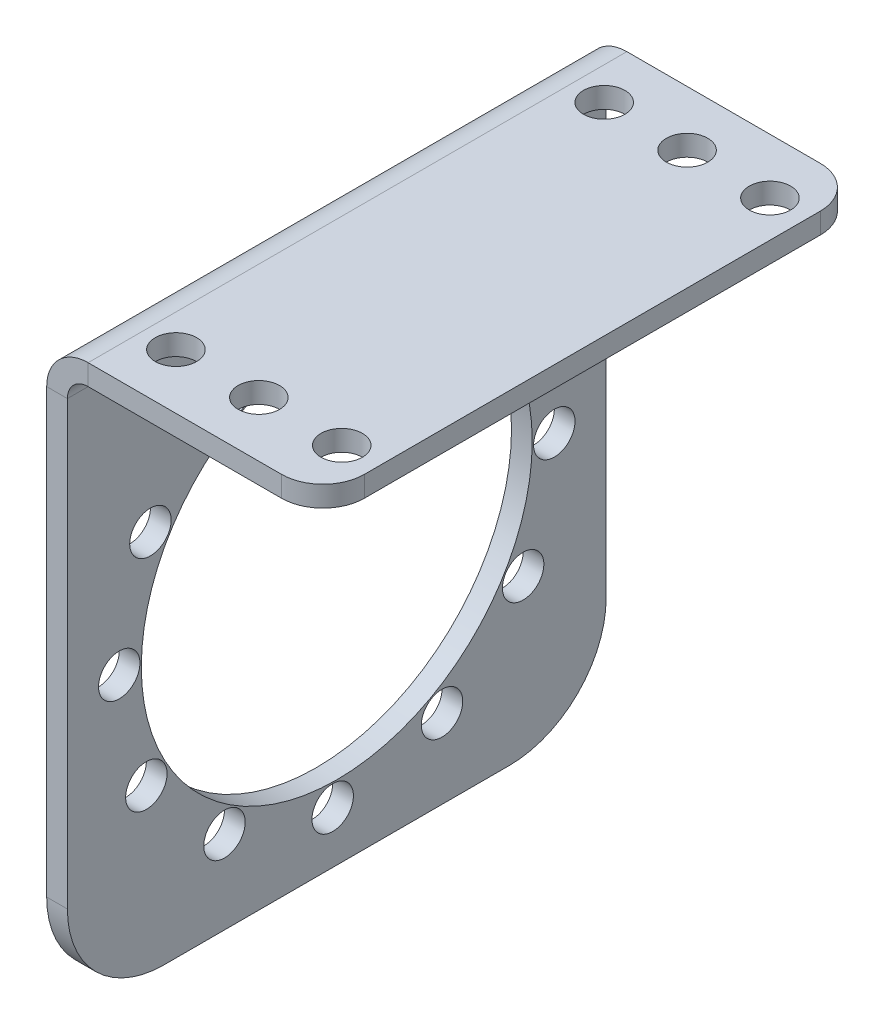
ISO-10303-21;
HEADER;
FILE_DESCRIPTION(('STEP AP214'),'2;1');
FILE_NAME('part.step','',(''),(''),'','','');
FILE_SCHEMA(('AUTOMOTIVE_DESIGN { 1 0 10303 214 1 1 1 1 }'));
ENDSEC;
DATA;
#1=APPLICATION_CONTEXT('core data for automotive mechanical design processes');
#2=APPLICATION_PROTOCOL_DEFINITION('international standard','automotive_design',2000,#1);
#3=PRODUCT_CONTEXT('',#1,'mechanical');
#4=PRODUCT('Part','Part','',(#3));
#5=PRODUCT_RELATED_PRODUCT_CATEGORY('part','',(#4));
#6=PRODUCT_DEFINITION_FORMATION('','',#4);
#7=PRODUCT_DEFINITION_CONTEXT('part definition',#1,'design');
#8=PRODUCT_DEFINITION('design','',#6,#7);
#9=PRODUCT_DEFINITION_SHAPE('','',#8);
#10=(LENGTH_UNIT() NAMED_UNIT(*) SI_UNIT(.MILLI.,.METRE.));
#11=(NAMED_UNIT(*) PLANE_ANGLE_UNIT() SI_UNIT($,.RADIAN.));
#12=(NAMED_UNIT(*) SI_UNIT($,.STERADIAN.) SOLID_ANGLE_UNIT());
#13=UNCERTAINTY_MEASURE_WITH_UNIT(LENGTH_MEASURE(1.E-05),#10,'distance_accuracy_value','');
#14=(GEOMETRIC_REPRESENTATION_CONTEXT(3) GLOBAL_UNCERTAINTY_ASSIGNED_CONTEXT((#13)) GLOBAL_UNIT_ASSIGNED_CONTEXT((#10,
#11,#12)) REPRESENTATION_CONTEXT('',''));
#15=CARTESIAN_POINT('',(0.,0.,0.));
#16=DIRECTION('',(0.,0.,1.));
#17=DIRECTION('',(1.,0.,0.));
#18=AXIS2_PLACEMENT_3D('',#15,#16,#17);
#19=CARTESIAN_POINT('',(-28.360100379747,28.4200909691457,39.));
#20=DIRECTION('',(0.,0.,1.));
#21=DIRECTION('',(1.,0.,0.));
#22=AXIS2_PLACEMENT_3D('',#19,#20,#21);
#23=PLANE('',#22);
#24=DIRECTION('',(0.,-1.,0.));
#25=VECTOR('',#24,1.);
#26=CARTESIAN_POINT('',(-28.360100379747,28.4200909691457,39.));
#27=LINE('',#26,#25);
#28=CARTESIAN_POINT('',(-28.360100379747,28.4200909691457,39.));
#29=VERTEX_POINT('',#28);
#30=CARTESIAN_POINT('',(-28.360100379747,26.9200909691457,39.));
#31=VERTEX_POINT('',#30);
#32=EDGE_CURVE('E131',#29,#31,#27,.T.);
#33=ORIENTED_EDGE('',*,*,#32,.F.);
#34=CARTESIAN_POINT('',(-28.360100379747,25.4200909691457,39.));
#35=DIRECTION('',(0.,0.,-1.));
#36=DIRECTION('',(-1.,0.,0.));
#37=AXIS2_PLACEMENT_3D('',#34,#35,#36);
#38=CIRCLE('',#37,3.);
#39=CARTESIAN_POINT('',(-31.360100379747,25.4200909691457,39.));
#40=VERTEX_POINT('',#39);
#41=EDGE_CURVE('E135',#40,#29,#38,.T.);
#42=ORIENTED_EDGE('',*,*,#41,.F.);
#43=DIRECTION('',(-1.,0.,0.));
#44=VECTOR('',#43,1.);
#45=CARTESIAN_POINT('',(-29.860100379747,25.4200909691457,39.));
#46=LINE('',#45,#44);
#47=CARTESIAN_POINT('',(-29.860100379747,25.4200909691457,39.));
#48=VERTEX_POINT('',#47);
#49=EDGE_CURVE('E140',#48,#40,#46,.T.);
#50=ORIENTED_EDGE('',*,*,#49,.F.);
#51=CARTESIAN_POINT('',(-28.360100379747,25.4200909691457,39.));
#52=DIRECTION('',(0.,0.,1.));
#53=DIRECTION('',(1.,0.,0.));
#54=AXIS2_PLACEMENT_3D('',#51,#52,#53);
#55=CIRCLE('',#54,1.5);
#56=EDGE_CURVE('E137',#48,#31,#55,.F.);
#57=ORIENTED_EDGE('',*,*,#56,.T.);
#58=EDGE_LOOP('',(#33,#42,#50,#57));
#59=FACE_BOUND('',#58,.T.);
#60=ADVANCED_FACE('F36',(#59),#23,.T.);
#61=CARTESIAN_POINT('',(-29.860100379747,25.4200909691457,39.));
#62=DIRECTION('',(0.,0.,1.));
#63=DIRECTION('',(1.,0.,0.));
#64=AXIS2_PLACEMENT_3D('',#61,#62,#63);
#65=PLANE('',#64);
#66=DIRECTION('',(1.,0.,0.));
#67=VECTOR('',#66,1.);
#68=CARTESIAN_POINT('',(-28.360100379747,26.9200909691457,39.));
#69=LINE('',#68,#67);
#70=CARTESIAN_POINT('',(-14.360100379747,26.9200909691457,39.));
#71=VERTEX_POINT('',#70);
#72=EDGE_CURVE('E155',#31,#71,#69,.T.);
#73=ORIENTED_EDGE('',*,*,#72,.T.);
#74=DIRECTION('',(0.,-1.,0.));
#75=VECTOR('',#74,1.);
#76=CARTESIAN_POINT('',(-14.360100379747,25.4200909691457,39.));
#77=LINE('',#76,#75);
#78=CARTESIAN_POINT('',(-14.360100379747,28.4200909691457,39.));
#79=VERTEX_POINT('',#78);
#80=EDGE_CURVE('E61',#71,#79,#77,.F.);
#81=ORIENTED_EDGE('',*,*,#80,.T.);
#82=DIRECTION('',(1.,0.,0.));
#83=VECTOR('',#82,1.);
#84=CARTESIAN_POINT('',(-28.360100379747,28.4200909691457,39.));
#85=LINE('',#84,#83);
#86=EDGE_CURVE('E145',#29,#79,#85,.T.);
#87=ORIENTED_EDGE('',*,*,#86,.F.);
#88=ORIENTED_EDGE('',*,*,#32,.T.);
#89=EDGE_LOOP('',(#73,#81,#87,#88));
#90=FACE_BOUND('',#89,.T.);
#91=ADVANCED_FACE('F154',(#90),#65,.T.);
#92=CARTESIAN_POINT('',(-31.360100379747,25.4200909691457,0.));
#93=DIRECTION('',(0.,0.,-1.));
#94=DIRECTION('',(-1.,0.,0.));
#95=AXIS2_PLACEMENT_3D('',#92,#93,#94);
#96=PLANE('',#95);
#97=DIRECTION('',(1.,0.,0.));
#98=VECTOR('',#97,1.);
#99=CARTESIAN_POINT('',(-31.360100379747,25.4200909691457,0.));
#100=LINE('',#99,#98);
#101=CARTESIAN_POINT('',(-31.360100379747,25.4200909691457,0.));
#102=VERTEX_POINT('',#101);
#103=CARTESIAN_POINT('',(-29.860100379747,25.4200909691457,0.));
#104=VERTEX_POINT('',#103);
#105=EDGE_CURVE('E201',#102,#104,#100,.T.);
#106=ORIENTED_EDGE('',*,*,#105,.F.);
#107=CARTESIAN_POINT('',(-28.360100379747,25.4200909691457,0.));
#108=DIRECTION('',(0.,0.,-1.));
#109=DIRECTION('',(-1.,0.,0.));
#110=AXIS2_PLACEMENT_3D('',#107,#108,#109);
#111=CIRCLE('',#110,3.);
#112=CARTESIAN_POINT('',(-28.360100379747,28.4200909691457,0.));
#113=VERTEX_POINT('',#112);
#114=EDGE_CURVE('E174',#102,#113,#111,.T.);
#115=ORIENTED_EDGE('',*,*,#114,.T.);
#116=DIRECTION('',(0.,1.,0.));
#117=VECTOR('',#116,1.);
#118=CARTESIAN_POINT('',(-28.360100379747,26.9200909691457,0.));
#119=LINE('',#118,#117);
#120=CARTESIAN_POINT('',(-28.360100379747,26.9200909691457,0.));
#121=VERTEX_POINT('',#120);
#122=EDGE_CURVE('E199',#121,#113,#119,.T.);
#123=ORIENTED_EDGE('',*,*,#122,.F.);
#124=CARTESIAN_POINT('',(-28.360100379747,25.4200909691457,0.));
#125=DIRECTION('',(0.,0.,1.));
#126=DIRECTION('',(1.,0.,0.));
#127=AXIS2_PLACEMENT_3D('',#124,#125,#126);
#128=CIRCLE('',#127,1.5);
#129=EDGE_CURVE('E180',#104,#121,#128,.F.);
#130=ORIENTED_EDGE('',*,*,#129,.F.);
#131=EDGE_LOOP('',(#106,#115,#123,#130));
#132=FACE_BOUND('',#131,.T.);
#133=ADVANCED_FACE('F334',(#132),#96,.T.);
#134=CARTESIAN_POINT('',(-28.360100379747,26.9200909691457,0.));
#135=DIRECTION('',(0.,0.,-1.));
#136=DIRECTION('',(-1.,0.,0.));
#137=AXIS2_PLACEMENT_3D('',#134,#135,#136);
#138=PLANE('',#137);
#139=DIRECTION('',(0.,1.,0.));
#140=VECTOR('',#139,1.);
#141=CARTESIAN_POINT('',(-29.860100379747,-13.5799090308543,0.));
#142=LINE('',#141,#140);
#143=CARTESIAN_POINT('',(-29.860100379747,-6.57990903085427,0.));
#144=VERTEX_POINT('',#143);
#145=EDGE_CURVE('E178',#144,#104,#142,.T.);
#146=ORIENTED_EDGE('',*,*,#145,.F.);
#147=DIRECTION('',(-1.,0.,0.));
#148=VECTOR('',#147,1.);
#149=CARTESIAN_POINT('',(-28.360100379747,-6.57990903085427,0.));
#150=LINE('',#149,#148);
#151=CARTESIAN_POINT('',(-31.360100379747,-6.57990903085427,0.));
#152=VERTEX_POINT('',#151);
#153=EDGE_CURVE('E220',#144,#152,#150,.T.);
#154=ORIENTED_EDGE('',*,*,#153,.T.);
#155=DIRECTION('',(0.,1.,0.));
#156=VECTOR('',#155,1.);
#157=CARTESIAN_POINT('',(-31.360100379747,-13.5799090308543,0.));
#158=LINE('',#157,#156);
#159=EDGE_CURVE('E176',#152,#102,#158,.T.);
#160=ORIENTED_EDGE('',*,*,#159,.T.);
#161=ORIENTED_EDGE('',*,*,#105,.T.);
#162=EDGE_LOOP('',(#146,#154,#160,#161));
#163=FACE_BOUND('',#162,.T.);
#164=ADVANCED_FACE('F351',(#163),#138,.T.);
#165=CARTESIAN_POINT('',(-28.360100379747,26.9200909691457,39.));
#166=DIRECTION('',(0.,1.,0.));
#167=DIRECTION('',(0.,0.,1.));
#168=AXIS2_PLACEMENT_3D('',#165,#166,#167);
#169=PLANE('',#168);
#170=CARTESIAN_POINT('',(-26.0021408674852,26.9200909691457,35.));
#171=DIRECTION('',(0.,1.,0.));
#172=DIRECTION('',(0.,0.,1.));
#173=AXIS2_PLACEMENT_3D('',#170,#171,#172);
#174=CIRCLE('',#173,1.5);
#175=CARTESIAN_POINT('',(-26.0021408674852,26.9200909691457,36.5));
#176=VERTEX_POINT('',#175);
#177=EDGE_CURVE('E484',#176,#176,#174,.T.);
#178=ORIENTED_EDGE('',*,*,#177,.T.);
#179=EDGE_LOOP('',(#178));
#180=FACE_BOUND('',#179,.T.);
#181=CARTESIAN_POINT('',(-14.0021408674852,26.9200909691457,35.));
#182=DIRECTION('',(0.,1.,0.));
#183=DIRECTION('',(0.,0.,1.));
#184=AXIS2_PLACEMENT_3D('',#181,#182,#183);
#185=CIRCLE('',#184,1.5);
#186=CARTESIAN_POINT('',(-14.0021408674852,26.9200909691457,36.5));
#187=VERTEX_POINT('',#186);
#188=EDGE_CURVE('E488',#187,#187,#185,.T.);
#189=ORIENTED_EDGE('',*,*,#188,.T.);
#190=EDGE_LOOP('',(#189));
#191=FACE_BOUND('',#190,.T.);
#192=CARTESIAN_POINT('',(-20.0021408674852,26.9200909691457,35.));
#193=DIRECTION('',(0.,1.,0.));
#194=DIRECTION('',(0.,0.,1.));
#195=AXIS2_PLACEMENT_3D('',#192,#193,#194);
#196=CIRCLE('',#195,1.5);
#197=CARTESIAN_POINT('',(-20.0021408674852,26.9200909691457,36.5));
#198=VERTEX_POINT('',#197);
#199=EDGE_CURVE('E497',#198,#198,#196,.T.);
#200=ORIENTED_EDGE('',*,*,#199,.T.);
#201=EDGE_LOOP('',(#200));
#202=FACE_BOUND('',#201,.T.);
#203=CARTESIAN_POINT('',(-14.0021408674855,26.9200909691457,4.));
#204=DIRECTION('',(0.,1.,0.));
#205=DIRECTION('',(0.,0.,1.));
#206=AXIS2_PLACEMENT_3D('',#203,#204,#205);
#207=CIRCLE('',#206,1.5);
#208=CARTESIAN_POINT('',(-14.0021408674855,26.9200909691457,5.5));
#209=VERTEX_POINT('',#208);
#210=EDGE_CURVE('E503',#209,#209,#207,.T.);
#211=ORIENTED_EDGE('',*,*,#210,.T.);
#212=EDGE_LOOP('',(#211));
#213=FACE_BOUND('',#212,.T.);
#214=CARTESIAN_POINT('',(-20.0021408674855,26.9200909691457,4.));
#215=DIRECTION('',(0.,1.,0.));
#216=DIRECTION('',(0.,0.,1.));
#217=AXIS2_PLACEMENT_3D('',#214,#215,#216);
#218=CIRCLE('',#217,1.5);
#219=CARTESIAN_POINT('',(-20.0021408674855,26.9200909691457,5.5));
#220=VERTEX_POINT('',#219);
#221=EDGE_CURVE('E509',#220,#220,#218,.T.);
#222=ORIENTED_EDGE('',*,*,#221,.T.);
#223=EDGE_LOOP('',(#222));
#224=FACE_BOUND('',#223,.T.);
#225=CARTESIAN_POINT('',(-26.0021408674855,26.9200909691457,4.));
#226=DIRECTION('',(0.,1.,0.));
#227=DIRECTION('',(0.,0.,1.));
#228=AXIS2_PLACEMENT_3D('',#225,#226,#227);
#229=CIRCLE('',#228,1.5);
#230=CARTESIAN_POINT('',(-26.0021408674855,26.9200909691457,5.5));
#231=VERTEX_POINT('',#230);
#232=EDGE_CURVE('E514',#231,#231,#229,.T.);
#233=ORIENTED_EDGE('',*,*,#232,.T.);
#234=EDGE_LOOP('',(#233));
#235=FACE_BOUND('',#234,.T.);
#236=DIRECTION('',(0.,0.,-1.));
#237=VECTOR('',#236,1.);
#238=CARTESIAN_POINT('',(-11.360100379747,26.9200909691457,39.));
#239=LINE('',#238,#237);
#240=CARTESIAN_POINT('',(-11.360100379747,26.9200909691457,36.));
#241=VERTEX_POINT('',#240);
#242=CARTESIAN_POINT('',(-11.360100379747,26.9200909691457,3.));
#243=VERTEX_POINT('',#242);
#244=EDGE_CURVE('E196',#241,#243,#239,.T.);
#245=ORIENTED_EDGE('',*,*,#244,.F.);
#246=CARTESIAN_POINT('',(-14.360100379747,26.9200909691457,36.));
#247=DIRECTION('',(0.,1.,0.));
#248=DIRECTION('',(0.,0.,1.));
#249=AXIS2_PLACEMENT_3D('',#246,#247,#248);
#250=CIRCLE('',#249,3.);
#251=EDGE_CURVE('E230',#241,#71,#250,.F.);
#252=ORIENTED_EDGE('',*,*,#251,.T.);
#253=ORIENTED_EDGE('',*,*,#72,.F.);
#254=DIRECTION('',(0.,0.,-1.));
#255=VECTOR('',#254,1.);
#256=CARTESIAN_POINT('',(-28.360100379747,26.9200909691457,39.));
#257=LINE('',#256,#255);
#258=EDGE_CURVE('E168',#31,#121,#257,.T.);
#259=ORIENTED_EDGE('',*,*,#258,.T.);
#260=DIRECTION('',(1.,0.,0.));
#261=VECTOR('',#260,1.);
#262=CARTESIAN_POINT('',(-28.360100379747,26.9200909691457,0.));
#263=LINE('',#262,#261);
#264=CARTESIAN_POINT('',(-14.360100379747,26.9200909691457,0.));
#265=VERTEX_POINT('',#264);
#266=EDGE_CURVE('E169',#121,#265,#263,.T.);
#267=ORIENTED_EDGE('',*,*,#266,.T.);
#268=CARTESIAN_POINT('',(-14.360100379747,26.9200909691457,3.));
#269=DIRECTION('',(0.,1.,0.));
#270=DIRECTION('',(0.,0.,1.));
#271=AXIS2_PLACEMENT_3D('',#268,#269,#270);
#272=CIRCLE('',#271,3.);
#273=EDGE_CURVE('E228',#265,#243,#272,.F.);
#274=ORIENTED_EDGE('',*,*,#273,.T.);
#275=EDGE_LOOP('',(#245,#252,#253,#259,#267,#274));
#276=FACE_BOUND('',#275,.T.);
#277=ADVANCED_FACE('F327',(#180,#191,#202,#213,#224,#235,#276),#169,.F.);
#278=CARTESIAN_POINT('',(-11.360100379747,28.4200909691457,39.));
#279=DIRECTION('',(1.,0.,0.));
#280=DIRECTION('',(0.,0.,-1.));
#281=AXIS2_PLACEMENT_3D('',#278,#279,#280);
#282=PLANE('',#281);
#283=DIRECTION('',(0.,0.,-1.));
#284=VECTOR('',#283,1.);
#285=CARTESIAN_POINT('',(-11.360100379747,28.4200909691457,39.));
#286=LINE('',#285,#284);
#287=CARTESIAN_POINT('',(-11.360100379747,28.4200909691457,36.));
#288=VERTEX_POINT('',#287);
#289=CARTESIAN_POINT('',(-11.360100379747,28.4200909691457,3.));
#290=VERTEX_POINT('',#289);
#291=EDGE_CURVE('E151',#288,#290,#286,.T.);
#292=ORIENTED_EDGE('',*,*,#291,.F.);
#293=DIRECTION('',(0.,-1.,0.));
#294=VECTOR('',#293,1.);
#295=CARTESIAN_POINT('',(-11.360100379747,28.4200909691457,36.));
#296=LINE('',#295,#294);
#297=EDGE_CURVE('E225',#288,#241,#296,.T.);
#298=ORIENTED_EDGE('',*,*,#297,.T.);
#299=ORIENTED_EDGE('',*,*,#244,.T.);
#300=DIRECTION('',(0.,-1.,0.));
#301=VECTOR('',#300,1.);
#302=CARTESIAN_POINT('',(-11.360100379747,28.4200909691457,3.));
#303=LINE('',#302,#301);
#304=EDGE_CURVE('E223',#243,#290,#303,.F.);
#305=ORIENTED_EDGE('',*,*,#304,.T.);
#306=EDGE_LOOP('',(#292,#298,#299,#305));
#307=FACE_BOUND('',#306,.T.);
#308=ADVANCED_FACE('F319',(#307),#282,.T.);
#309=CARTESIAN_POINT('',(-28.360100379747,28.4200909691457,39.));
#310=DIRECTION('',(0.,1.,0.));
#311=DIRECTION('',(0.,0.,1.));
#312=AXIS2_PLACEMENT_3D('',#309,#310,#311);
#313=PLANE('',#312);
#314=CARTESIAN_POINT('',(-26.0021408674852,28.4200909691457,35.));
#315=DIRECTION('',(0.,1.,0.));
#316=DIRECTION('',(0.,0.,1.));
#317=AXIS2_PLACEMENT_3D('',#314,#315,#316);
#318=CIRCLE('',#317,1.5);
#319=CARTESIAN_POINT('',(-26.0021408674852,28.4200909691457,36.5));
#320=VERTEX_POINT('',#319);
#321=EDGE_CURVE('E481',#320,#320,#318,.T.);
#322=ORIENTED_EDGE('',*,*,#321,.F.);
#323=EDGE_LOOP('',(#322));
#324=FACE_BOUND('',#323,.T.);
#325=CARTESIAN_POINT('',(-14.0021408674852,28.4200909691457,35.));
#326=DIRECTION('',(0.,1.,0.));
#327=DIRECTION('',(0.,0.,1.));
#328=AXIS2_PLACEMENT_3D('',#325,#326,#327);
#329=CIRCLE('',#328,1.5);
#330=CARTESIAN_POINT('',(-14.0021408674852,28.4200909691457,36.5));
#331=VERTEX_POINT('',#330);
#332=EDGE_CURVE('E485',#331,#331,#329,.T.);
#333=ORIENTED_EDGE('',*,*,#332,.F.);
#334=EDGE_LOOP('',(#333));
#335=FACE_BOUND('',#334,.T.);
#336=CARTESIAN_POINT('',(-20.0021408674852,28.4200909691457,35.));
#337=DIRECTION('',(0.,1.,0.));
#338=DIRECTION('',(0.,0.,1.));
#339=AXIS2_PLACEMENT_3D('',#336,#337,#338);
#340=CIRCLE('',#339,1.5);
#341=CARTESIAN_POINT('',(-20.0021408674852,28.4200909691457,36.5));
#342=VERTEX_POINT('',#341);
#343=EDGE_CURVE('E494',#342,#342,#340,.T.);
#344=ORIENTED_EDGE('',*,*,#343,.F.);
#345=EDGE_LOOP('',(#344));
#346=FACE_BOUND('',#345,.T.);
#347=CARTESIAN_POINT('',(-14.0021408674855,28.4200909691457,4.));
#348=DIRECTION('',(0.,1.,0.));
#349=DIRECTION('',(0.,0.,1.));
#350=AXIS2_PLACEMENT_3D('',#347,#348,#349);
#351=CIRCLE('',#350,1.5);
#352=CARTESIAN_POINT('',(-14.0021408674855,28.4200909691457,5.5));
#353=VERTEX_POINT('',#352);
#354=EDGE_CURVE('E500',#353,#353,#351,.T.);
#355=ORIENTED_EDGE('',*,*,#354,.F.);
#356=EDGE_LOOP('',(#355));
#357=FACE_BOUND('',#356,.T.);
#358=CARTESIAN_POINT('',(-20.0021408674855,28.4200909691457,4.));
#359=DIRECTION('',(0.,1.,0.));
#360=DIRECTION('',(0.,0.,1.));
#361=AXIS2_PLACEMENT_3D('',#358,#359,#360);
#362=CIRCLE('',#361,1.5);
#363=CARTESIAN_POINT('',(-20.0021408674855,28.4200909691457,5.5));
#364=VERTEX_POINT('',#363);
#365=EDGE_CURVE('E506',#364,#364,#362,.T.);
#366=ORIENTED_EDGE('',*,*,#365,.F.);
#367=EDGE_LOOP('',(#366));
#368=FACE_BOUND('',#367,.T.);
#369=CARTESIAN_POINT('',(-26.0021408674855,28.4200909691457,4.));
#370=DIRECTION('',(0.,1.,0.));
#371=DIRECTION('',(0.,0.,1.));
#372=AXIS2_PLACEMENT_3D('',#369,#370,#371);
#373=CIRCLE('',#372,1.5);
#374=CARTESIAN_POINT('',(-26.0021408674855,28.4200909691457,5.5));
#375=VERTEX_POINT('',#374);
#376=EDGE_CURVE('E512',#375,#375,#373,.T.);
#377=ORIENTED_EDGE('',*,*,#376,.F.);
#378=EDGE_LOOP('',(#377));
#379=FACE_BOUND('',#378,.T.);
#380=ORIENTED_EDGE('',*,*,#86,.T.);
#381=CARTESIAN_POINT('',(-14.360100379747,28.4200909691457,36.));
#382=DIRECTION('',(0.,1.,0.));
#383=DIRECTION('',(0.,0.,1.));
#384=AXIS2_PLACEMENT_3D('',#381,#382,#383);
#385=CIRCLE('',#384,3.);
#386=EDGE_CURVE('E45',#79,#288,#385,.T.);
#387=ORIENTED_EDGE('',*,*,#386,.T.);
#388=ORIENTED_EDGE('',*,*,#291,.T.);
#389=CARTESIAN_POINT('',(-14.360100379747,28.4200909691457,3.));
#390=DIRECTION('',(0.,1.,0.));
#391=DIRECTION('',(0.,0.,1.));
#392=AXIS2_PLACEMENT_3D('',#389,#390,#391);
#393=CIRCLE('',#392,3.);
#394=CARTESIAN_POINT('',(-14.360100379747,28.4200909691457,0.));
#395=VERTEX_POINT('',#394);
#396=EDGE_CURVE('E53',#290,#395,#393,.T.);
#397=ORIENTED_EDGE('',*,*,#396,.T.);
#398=DIRECTION('',(1.,0.,0.));
#399=VECTOR('',#398,1.);
#400=CARTESIAN_POINT('',(-28.360100379747,28.4200909691457,0.));
#401=LINE('',#400,#399);
#402=EDGE_CURVE('E147',#113,#395,#401,.T.);
#403=ORIENTED_EDGE('',*,*,#402,.F.);
#404=DIRECTION('',(0.,0.,-1.));
#405=VECTOR('',#404,1.);
#406=CARTESIAN_POINT('',(-28.360100379747,28.4200909691457,39.));
#407=LINE('',#406,#405);
#408=EDGE_CURVE('E143',#29,#113,#407,.T.);
#409=ORIENTED_EDGE('',*,*,#408,.F.);
#410=EDGE_LOOP('',(#380,#387,#388,#397,#403,#409));
#411=FACE_BOUND('',#410,.T.);
#412=ADVANCED_FACE('F144',(#324,#335,#346,#357,#368,#379,#411),#313,.T.);
#413=CARTESIAN_POINT('',(-28.360100379747,25.4200909691457,39.));
#414=DIRECTION('',(0.,0.,-1.));
#415=DIRECTION('',(-1.,0.,0.));
#416=AXIS2_PLACEMENT_3D('',#413,#414,#415);
#417=CYLINDRICAL_SURFACE('',#416,3.);
#418=ORIENTED_EDGE('',*,*,#114,.F.);
#419=DIRECTION('',(0.,0.,-1.));
#420=VECTOR('',#419,1.);
#421=CARTESIAN_POINT('',(-31.360100379747,25.4200909691457,39.));
#422=LINE('',#421,#420);
#423=EDGE_CURVE('E152',#40,#102,#422,.T.);
#424=ORIENTED_EDGE('',*,*,#423,.F.);
#425=ORIENTED_EDGE('',*,*,#41,.T.);
#426=ORIENTED_EDGE('',*,*,#408,.T.);
#427=EDGE_LOOP('',(#418,#424,#425,#426));
#428=FACE_BOUND('',#427,.T.);
#429=ADVANCED_FACE('F158',(#428),#417,.T.);
#430=CARTESIAN_POINT('',(-31.360100379747,-13.5799090308543,39.));
#431=DIRECTION('',(-1.,0.,0.));
#432=DIRECTION('',(0.,0.,1.));
#433=AXIS2_PLACEMENT_3D('',#430,#431,#432);
#434=PLANE('',#433);
#435=CARTESIAN_POINT('',(-31.360100379747,19.4127922964614,11.3707334214373));
#436=DIRECTION('',(-1.,0.,0.));
#437=DIRECTION('',(0.,0.,1.));
#438=AXIS2_PLACEMENT_3D('',#435,#436,#437);
#439=CIRCLE('',#438,1.5);
#440=CARTESIAN_POINT('',(-31.360100379747,19.4127922964614,12.8707334214373));
#441=VERTEX_POINT('',#440);
#442=EDGE_CURVE('E289',#441,#441,#439,.T.);
#443=ORIENTED_EDGE('',*,*,#442,.F.);
#444=EDGE_LOOP('',(#443));
#445=FACE_BOUND('',#444,.T.);
#446=CARTESIAN_POINT('',(-31.360100379747,13.5408762229751,5.71487378974741));
#447=DIRECTION('',(-1.,0.,0.));
#448=DIRECTION('',(0.,0.,1.));
#449=AXIS2_PLACEMENT_3D('',#446,#447,#448);
#450=CIRCLE('',#449,1.5);
#451=CARTESIAN_POINT('',(-31.360100379747,13.5408762229751,7.21487378974741));
#452=VERTEX_POINT('',#451);
#453=EDGE_CURVE('E279',#452,#452,#450,.T.);
#454=ORIENTED_EDGE('',*,*,#453,.F.);
#455=EDGE_LOOP('',(#454));
#456=FACE_BOUND('',#455,.T.);
#457=CARTESIAN_POINT('',(-31.360100379747,5.62771791860088,3.75271370520823));
#458=DIRECTION('',(-1.,0.,0.));
#459=DIRECTION('',(0.,0.,1.));
#460=AXIS2_PLACEMENT_3D('',#457,#458,#459);
#461=CIRCLE('',#460,1.5);
#462=CARTESIAN_POINT('',(-31.360100379747,5.62771791860088,5.25271370520823));
#463=VERTEX_POINT('',#462);
#464=EDGE_CURVE('E276',#463,#463,#461,.T.);
#465=ORIENTED_EDGE('',*,*,#464,.F.);
#466=EDGE_LOOP('',(#465));
#467=FACE_BOUND('',#466,.T.);
#468=CARTESIAN_POINT('',(-31.360100379747,-2.20635823942458,6.01001237789258));
#469=DIRECTION('',(-1.,0.,0.));
#470=DIRECTION('',(0.,0.,1.));
#471=AXIS2_PLACEMENT_3D('',#468,#469,#470);
#472=CIRCLE('',#471,1.5);
#473=CARTESIAN_POINT('',(-31.360100379747,-2.20635823942458,7.51001237789258));
#474=VERTEX_POINT('',#473);
#475=EDGE_CURVE('E273',#474,#474,#472,.T.);
#476=ORIENTED_EDGE('',*,*,#475,.F.);
#477=EDGE_LOOP('',(#476));
#478=FACE_BOUND('',#477,.T.);
#479=CARTESIAN_POINT('',(-31.360100379747,-7.86221787111444,11.8819284513788));
#480=DIRECTION('',(-1.,0.,0.));
#481=DIRECTION('',(0.,0.,1.));
#482=AXIS2_PLACEMENT_3D('',#479,#480,#481);
#483=CIRCLE('',#482,1.5);
#484=CARTESIAN_POINT('',(-31.360100379747,-7.86221787111444,13.3819284513789));
#485=VERTEX_POINT('',#484);
#486=EDGE_CURVE('E269',#485,#485,#483,.T.);
#487=ORIENTED_EDGE('',*,*,#486,.F.);
#488=EDGE_LOOP('',(#487));
#489=FACE_BOUND('',#488,.T.);
#490=CARTESIAN_POINT('',(-31.360100379747,-9.82437795565363,19.7950867557531));
#491=DIRECTION('',(-1.,0.,0.));
#492=DIRECTION('',(0.,0.,1.));
#493=AXIS2_PLACEMENT_3D('',#490,#491,#492);
#494=CIRCLE('',#493,1.5);
#495=CARTESIAN_POINT('',(-31.360100379747,-9.82437795565363,21.2950867557531));
#496=VERTEX_POINT('',#495);
#497=EDGE_CURVE('E265',#496,#496,#494,.T.);
#498=ORIENTED_EDGE('',*,*,#497,.F.);
#499=EDGE_LOOP('',(#498));
#500=FACE_BOUND('',#499,.T.);
#501=CARTESIAN_POINT('',(-31.360100379747,-7.56707928296928,27.6291629137785));
#502=DIRECTION('',(-1.,0.,0.));
#503=DIRECTION('',(0.,0.,1.));
#504=AXIS2_PLACEMENT_3D('',#501,#502,#503);
#505=CIRCLE('',#504,1.5);
#506=CARTESIAN_POINT('',(-31.360100379747,-7.56707928296928,29.1291629137785));
#507=VERTEX_POINT('',#506);
#508=EDGE_CURVE('E261',#507,#507,#505,.T.);
#509=ORIENTED_EDGE('',*,*,#508,.F.);
#510=EDGE_LOOP('',(#509));
#511=FACE_BOUND('',#510,.T.);
#512=CARTESIAN_POINT('',(-31.360100379747,-1.69516320948301,33.2850225454684));
#513=DIRECTION('',(-1.,0.,0.));
#514=DIRECTION('',(0.,0.,1.));
#515=AXIS2_PLACEMENT_3D('',#512,#513,#514);
#516=CIRCLE('',#515,1.5);
#517=CARTESIAN_POINT('',(-31.360100379747,-1.69516320948301,34.7850225454684));
#518=VERTEX_POINT('',#517);
#519=EDGE_CURVE('E257',#518,#518,#516,.T.);
#520=ORIENTED_EDGE('',*,*,#519,.F.);
#521=EDGE_LOOP('',(#520));
#522=FACE_BOUND('',#521,.T.);
#523=CARTESIAN_POINT('',(-31.360100379747,6.2179950948912,35.2471826300076));
#524=DIRECTION('',(-1.,0.,0.));
#525=DIRECTION('',(0.,0.,1.));
#526=AXIS2_PLACEMENT_3D('',#523,#524,#525);
#527=CIRCLE('',#526,1.5);
#528=CARTESIAN_POINT('',(-31.360100379747,6.2179950948912,36.7471826300076));
#529=VERTEX_POINT('',#528);
#530=EDGE_CURVE('E253',#529,#529,#527,.T.);
#531=ORIENTED_EDGE('',*,*,#530,.F.);
#532=EDGE_LOOP('',(#531));
#533=FACE_BOUND('',#532,.T.);
#534=CARTESIAN_POINT('',(-31.360100379747,14.0520712529167,32.9898839573232));
#535=DIRECTION('',(-1.,0.,0.));
#536=DIRECTION('',(0.,0.,1.));
#537=AXIS2_PLACEMENT_3D('',#534,#535,#536);
#538=CIRCLE('',#537,1.5);
#539=CARTESIAN_POINT('',(-31.360100379747,14.0520712529167,34.4898839573232));
#540=VERTEX_POINT('',#539);
#541=EDGE_CURVE('E249',#540,#540,#538,.T.);
#542=ORIENTED_EDGE('',*,*,#541,.F.);
#543=EDGE_LOOP('',(#542));
#544=FACE_BOUND('',#543,.T.);
#545=CARTESIAN_POINT('',(-31.360100379747,19.7079308846065,27.1179678838369));
#546=DIRECTION('',(-1.,0.,0.));
#547=DIRECTION('',(0.,0.,1.));
#548=AXIS2_PLACEMENT_3D('',#545,#546,#547);
#549=CIRCLE('',#548,1.5);
#550=CARTESIAN_POINT('',(-31.360100379747,19.7079308846065,28.617967883837));
#551=VERTEX_POINT('',#550);
#552=EDGE_CURVE('E245',#551,#551,#549,.T.);
#553=ORIENTED_EDGE('',*,*,#552,.F.);
#554=EDGE_LOOP('',(#553));
#555=FACE_BOUND('',#554,.T.);
#556=CARTESIAN_POINT('',(-31.360100379747,21.6700909691457,19.2048095794627));
#557=DIRECTION('',(-1.,0.,0.));
#558=DIRECTION('',(0.,0.,1.));
#559=AXIS2_PLACEMENT_3D('',#556,#557,#558);
#560=CIRCLE('',#559,1.5);
#561=CARTESIAN_POINT('',(-31.360100379747,21.6700909691457,20.7048095794627));
#562=VERTEX_POINT('',#561);
#563=EDGE_CURVE('E241',#562,#562,#560,.T.);
#564=ORIENTED_EDGE('',*,*,#563,.F.);
#565=EDGE_LOOP('',(#564));
#566=FACE_BOUND('',#565,.T.);
#567=CARTESIAN_POINT('',(-31.360100379747,5.92009096914571,19.5));
#568=DIRECTION('',(-1.,0.,0.));
#569=DIRECTION('',(0.,0.,1.));
#570=AXIS2_PLACEMENT_3D('',#567,#568,#569);
#571=CIRCLE('',#570,14.15);
#572=CARTESIAN_POINT('',(-31.360100379747,5.92009096914571,33.65));
#573=VERTEX_POINT('',#572);
#574=EDGE_CURVE('E237',#573,#573,#571,.T.);
#575=ORIENTED_EDGE('',*,*,#574,.F.);
#576=EDGE_LOOP('',(#575));
#577=FACE_BOUND('',#576,.T.);
#578=DIRECTION('',(0.,0.,-1.));
#579=VECTOR('',#578,1.);
#580=CARTESIAN_POINT('',(-31.360100379747,-13.5799090308543,39.));
#581=LINE('',#580,#579);
#582=CARTESIAN_POINT('',(-31.360100379747,-13.5799090308543,32.));
#583=VERTEX_POINT('',#582);
#584=CARTESIAN_POINT('',(-31.360100379747,-13.5799090308543,7.));
#585=VERTEX_POINT('',#584);
#586=EDGE_CURVE('E191',#583,#585,#581,.T.);
#587=ORIENTED_EDGE('',*,*,#586,.F.);
#588=CARTESIAN_POINT('',(-31.360100379747,-6.57990903085427,32.));
#589=DIRECTION('',(-1.,0.,0.));
#590=DIRECTION('',(0.,0.,1.));
#591=AXIS2_PLACEMENT_3D('',#588,#589,#590);
#592=CIRCLE('',#591,7.);
#593=CARTESIAN_POINT('',(-31.360100379747,-6.57990903085427,39.));
#594=VERTEX_POINT('',#593);
#595=EDGE_CURVE('E212',#583,#594,#592,.T.);
#596=ORIENTED_EDGE('',*,*,#595,.T.);
#597=DIRECTION('',(0.,1.,0.));
#598=VECTOR('',#597,1.);
#599=CARTESIAN_POINT('',(-31.360100379747,-13.5799090308543,39.));
#600=LINE('',#599,#598);
#601=EDGE_CURVE('E160',#594,#40,#600,.T.);
#602=ORIENTED_EDGE('',*,*,#601,.T.);
#603=ORIENTED_EDGE('',*,*,#423,.T.);
#604=ORIENTED_EDGE('',*,*,#159,.F.);
#605=CARTESIAN_POINT('',(-31.360100379747,-6.57990903085427,7.));
#606=DIRECTION('',(-1.,0.,0.));
#607=DIRECTION('',(0.,0.,1.));
#608=AXIS2_PLACEMENT_3D('',#605,#606,#607);
#609=CIRCLE('',#608,7.);
#610=EDGE_CURVE('E210',#152,#585,#609,.T.);
#611=ORIENTED_EDGE('',*,*,#610,.T.);
#612=EDGE_LOOP('',(#587,#596,#602,#603,#604,#611));
#613=FACE_BOUND('',#612,.T.);
#614=ADVANCED_FACE('F340',(#445,#456,#467,#478,#489,#500,#511,#522,#533,#544,#555,#566,#577,
#613),#434,.T.);
#615=CARTESIAN_POINT('',(-29.860100379747,-13.5799090308543,39.));
#616=DIRECTION('',(0.,-1.,0.));
#617=DIRECTION('',(0.,0.,-1.));
#618=AXIS2_PLACEMENT_3D('',#615,#616,#617);
#619=PLANE('',#618);
#620=DIRECTION('',(0.,0.,-1.));
#621=VECTOR('',#620,1.);
#622=CARTESIAN_POINT('',(-29.860100379747,-13.5799090308543,39.));
#623=LINE('',#622,#621);
#624=CARTESIAN_POINT('',(-29.860100379747,-13.5799090308543,32.));
#625=VERTEX_POINT('',#624);
#626=CARTESIAN_POINT('',(-29.860100379747,-13.5799090308543,7.));
#627=VERTEX_POINT('',#626);
#628=EDGE_CURVE('E188',#625,#627,#623,.T.);
#629=ORIENTED_EDGE('',*,*,#628,.F.);
#630=DIRECTION('',(-1.,0.,0.));
#631=VECTOR('',#630,1.);
#632=CARTESIAN_POINT('',(-31.360100379747,-13.5799090308543,32.));
#633=LINE('',#632,#631);
#634=EDGE_CURVE('E207',#625,#583,#633,.T.);
#635=ORIENTED_EDGE('',*,*,#634,.T.);
#636=ORIENTED_EDGE('',*,*,#586,.T.);
#637=DIRECTION('',(-1.,0.,0.));
#638=VECTOR('',#637,1.);
#639=CARTESIAN_POINT('',(-29.860100379747,-13.5799090308543,7.));
#640=LINE('',#639,#638);
#641=EDGE_CURVE('E139',#585,#627,#640,.F.);
#642=ORIENTED_EDGE('',*,*,#641,.T.);
#643=EDGE_LOOP('',(#629,#635,#636,#642));
#644=FACE_BOUND('',#643,.T.);
#645=ADVANCED_FACE('F357',(#644),#619,.T.);
#646=CARTESIAN_POINT('',(-29.860100379747,-13.5799090308543,39.));
#647=DIRECTION('',(-1.,0.,0.));
#648=DIRECTION('',(0.,0.,1.));
#649=AXIS2_PLACEMENT_3D('',#646,#647,#648);
#650=PLANE('',#649);
#651=CARTESIAN_POINT('',(-29.860100379747,19.4127922964614,11.3707334214373));
#652=DIRECTION('',(-1.,0.,0.));
#653=DIRECTION('',(0.,0.,1.));
#654=AXIS2_PLACEMENT_3D('',#651,#652,#653);
#655=CIRCLE('',#654,1.5);
#656=CARTESIAN_POINT('',(-29.860100379747,19.4127922964614,12.8707334214373));
#657=VERTEX_POINT('',#656);
#658=EDGE_CURVE('E40',#657,#657,#655,.T.);
#659=ORIENTED_EDGE('',*,*,#658,.T.);
#660=EDGE_LOOP('',(#659));
#661=FACE_BOUND('',#660,.T.);
#662=CARTESIAN_POINT('',(-29.860100379747,13.5408762229751,5.71487378974741));
#663=DIRECTION('',(-1.,0.,0.));
#664=DIRECTION('',(0.,0.,1.));
#665=AXIS2_PLACEMENT_3D('',#662,#663,#664);
#666=CIRCLE('',#665,1.5);
#667=CARTESIAN_POINT('',(-29.860100379747,13.5408762229751,7.21487378974741));
#668=VERTEX_POINT('',#667);
#669=EDGE_CURVE('E277',#668,#668,#666,.T.);
#670=ORIENTED_EDGE('',*,*,#669,.T.);
#671=EDGE_LOOP('',(#670));
#672=FACE_BOUND('',#671,.T.);
#673=CARTESIAN_POINT('',(-29.860100379747,5.62771791860088,3.75271370520823));
#674=DIRECTION('',(-1.,0.,0.));
#675=DIRECTION('',(0.,0.,1.));
#676=AXIS2_PLACEMENT_3D('',#673,#674,#675);
#677=CIRCLE('',#676,1.5);
#678=CARTESIAN_POINT('',(-29.860100379747,5.62771791860088,5.25271370520823));
#679=VERTEX_POINT('',#678);
#680=EDGE_CURVE('E274',#679,#679,#677,.T.);
#681=ORIENTED_EDGE('',*,*,#680,.T.);
#682=EDGE_LOOP('',(#681));
#683=FACE_BOUND('',#682,.T.);
#684=CARTESIAN_POINT('',(-29.860100379747,-2.20635823942458,6.01001237789258));
#685=DIRECTION('',(-1.,0.,0.));
#686=DIRECTION('',(0.,0.,1.));
#687=AXIS2_PLACEMENT_3D('',#684,#685,#686);
#688=CIRCLE('',#687,1.5);
#689=CARTESIAN_POINT('',(-29.860100379747,-2.20635823942458,7.51001237789258));
#690=VERTEX_POINT('',#689);
#691=EDGE_CURVE('E270',#690,#690,#688,.T.);
#692=ORIENTED_EDGE('',*,*,#691,.T.);
#693=EDGE_LOOP('',(#692));
#694=FACE_BOUND('',#693,.T.);
#695=CARTESIAN_POINT('',(-29.860100379747,-7.86221787111444,11.8819284513788));
#696=DIRECTION('',(-1.,0.,0.));
#697=DIRECTION('',(0.,0.,1.));
#698=AXIS2_PLACEMENT_3D('',#695,#696,#697);
#699=CIRCLE('',#698,1.5);
#700=CARTESIAN_POINT('',(-29.860100379747,-7.86221787111444,13.3819284513789));
#701=VERTEX_POINT('',#700);
#702=EDGE_CURVE('E266',#701,#701,#699,.T.);
#703=ORIENTED_EDGE('',*,*,#702,.T.);
#704=EDGE_LOOP('',(#703));
#705=FACE_BOUND('',#704,.T.);
#706=CARTESIAN_POINT('',(-29.860100379747,-9.82437795565363,19.7950867557531));
#707=DIRECTION('',(-1.,0.,0.));
#708=DIRECTION('',(0.,0.,1.));
#709=AXIS2_PLACEMENT_3D('',#706,#707,#708);
#710=CIRCLE('',#709,1.5);
#711=CARTESIAN_POINT('',(-29.860100379747,-9.82437795565363,21.2950867557531));
#712=VERTEX_POINT('',#711);
#713=EDGE_CURVE('E262',#712,#712,#710,.T.);
#714=ORIENTED_EDGE('',*,*,#713,.T.);
#715=EDGE_LOOP('',(#714));
#716=FACE_BOUND('',#715,.T.);
#717=CARTESIAN_POINT('',(-29.860100379747,-7.56707928296928,27.6291629137785));
#718=DIRECTION('',(-1.,0.,0.));
#719=DIRECTION('',(0.,0.,1.));
#720=AXIS2_PLACEMENT_3D('',#717,#718,#719);
#721=CIRCLE('',#720,1.5);
#722=CARTESIAN_POINT('',(-29.860100379747,-7.56707928296928,29.1291629137785));
#723=VERTEX_POINT('',#722);
#724=EDGE_CURVE('E258',#723,#723,#721,.T.);
#725=ORIENTED_EDGE('',*,*,#724,.T.);
#726=EDGE_LOOP('',(#725));
#727=FACE_BOUND('',#726,.T.);
#728=CARTESIAN_POINT('',(-29.860100379747,-1.69516320948301,33.2850225454684));
#729=DIRECTION('',(-1.,0.,0.));
#730=DIRECTION('',(0.,0.,1.));
#731=AXIS2_PLACEMENT_3D('',#728,#729,#730);
#732=CIRCLE('',#731,1.5);
#733=CARTESIAN_POINT('',(-29.860100379747,-1.69516320948301,34.7850225454684));
#734=VERTEX_POINT('',#733);
#735=EDGE_CURVE('E254',#734,#734,#732,.T.);
#736=ORIENTED_EDGE('',*,*,#735,.T.);
#737=EDGE_LOOP('',(#736));
#738=FACE_BOUND('',#737,.T.);
#739=CARTESIAN_POINT('',(-29.860100379747,6.2179950948912,35.2471826300076));
#740=DIRECTION('',(-1.,0.,0.));
#741=DIRECTION('',(0.,0.,1.));
#742=AXIS2_PLACEMENT_3D('',#739,#740,#741);
#743=CIRCLE('',#742,1.5);
#744=CARTESIAN_POINT('',(-29.860100379747,6.2179950948912,36.7471826300076));
#745=VERTEX_POINT('',#744);
#746=EDGE_CURVE('E250',#745,#745,#743,.T.);
#747=ORIENTED_EDGE('',*,*,#746,.T.);
#748=EDGE_LOOP('',(#747));
#749=FACE_BOUND('',#748,.T.);
#750=CARTESIAN_POINT('',(-29.860100379747,14.0520712529167,32.9898839573232));
#751=DIRECTION('',(-1.,0.,0.));
#752=DIRECTION('',(0.,0.,1.));
#753=AXIS2_PLACEMENT_3D('',#750,#751,#752);
#754=CIRCLE('',#753,1.5);
#755=CARTESIAN_POINT('',(-29.860100379747,14.0520712529167,34.4898839573232));
#756=VERTEX_POINT('',#755);
#757=EDGE_CURVE('E246',#756,#756,#754,.T.);
#758=ORIENTED_EDGE('',*,*,#757,.T.);
#759=EDGE_LOOP('',(#758));
#760=FACE_BOUND('',#759,.T.);
#761=CARTESIAN_POINT('',(-29.860100379747,19.7079308846065,27.1179678838369));
#762=DIRECTION('',(-1.,0.,0.));
#763=DIRECTION('',(0.,0.,1.));
#764=AXIS2_PLACEMENT_3D('',#761,#762,#763);
#765=CIRCLE('',#764,1.5);
#766=CARTESIAN_POINT('',(-29.860100379747,19.7079308846065,28.617967883837));
#767=VERTEX_POINT('',#766);
#768=EDGE_CURVE('E242',#767,#767,#765,.T.);
#769=ORIENTED_EDGE('',*,*,#768,.T.);
#770=EDGE_LOOP('',(#769));
#771=FACE_BOUND('',#770,.T.);
#772=CARTESIAN_POINT('',(-29.860100379747,21.6700909691457,19.2048095794627));
#773=DIRECTION('',(-1.,0.,0.));
#774=DIRECTION('',(0.,0.,1.));
#775=AXIS2_PLACEMENT_3D('',#772,#773,#774);
#776=CIRCLE('',#775,1.5);
#777=CARTESIAN_POINT('',(-29.860100379747,21.6700909691457,20.7048095794627));
#778=VERTEX_POINT('',#777);
#779=EDGE_CURVE('E238',#778,#778,#776,.T.);
#780=ORIENTED_EDGE('',*,*,#779,.T.);
#781=EDGE_LOOP('',(#780));
#782=FACE_BOUND('',#781,.T.);
#783=CARTESIAN_POINT('',(-29.860100379747,5.92009096914571,19.5));
#784=DIRECTION('',(-1.,0.,0.));
#785=DIRECTION('',(0.,0.,1.));
#786=AXIS2_PLACEMENT_3D('',#783,#784,#785);
#787=CIRCLE('',#786,14.15);
#788=CARTESIAN_POINT('',(-29.860100379747,5.92009096914571,33.65));
#789=VERTEX_POINT('',#788);
#790=EDGE_CURVE('E172',#789,#789,#787,.T.);
#791=ORIENTED_EDGE('',*,*,#790,.T.);
#792=EDGE_LOOP('',(#791));
#793=FACE_BOUND('',#792,.T.);
#794=DIRECTION('',(0.,1.,0.));
#795=VECTOR('',#794,1.);
#796=CARTESIAN_POINT('',(-29.860100379747,-13.5799090308543,39.));
#797=LINE('',#796,#795);
#798=CARTESIAN_POINT('',(-29.860100379747,-6.57990903085427,39.));
#799=VERTEX_POINT('',#798);
#800=EDGE_CURVE('E162',#799,#48,#797,.T.);
#801=ORIENTED_EDGE('',*,*,#800,.F.);
#802=CARTESIAN_POINT('',(-29.860100379747,-6.57990903085427,32.));
#803=DIRECTION('',(-1.,0.,0.));
#804=DIRECTION('',(0.,0.,1.));
#805=AXIS2_PLACEMENT_3D('',#802,#803,#804);
#806=CIRCLE('',#805,7.);
#807=EDGE_CURVE('E218',#799,#625,#806,.F.);
#808=ORIENTED_EDGE('',*,*,#807,.T.);
#809=ORIENTED_EDGE('',*,*,#628,.T.);
#810=CARTESIAN_POINT('',(-29.860100379747,-6.57990903085427,7.));
#811=DIRECTION('',(-1.,0.,0.));
#812=DIRECTION('',(0.,0.,1.));
#813=AXIS2_PLACEMENT_3D('',#810,#811,#812);
#814=CIRCLE('',#813,7.);
#815=EDGE_CURVE('E216',#627,#144,#814,.F.);
#816=ORIENTED_EDGE('',*,*,#815,.T.);
#817=ORIENTED_EDGE('',*,*,#145,.T.);
#818=DIRECTION('',(0.,0.,-1.));
#819=VECTOR('',#818,1.);
#820=CARTESIAN_POINT('',(-29.860100379747,25.4200909691457,39.));
#821=LINE('',#820,#819);
#822=EDGE_CURVE('E185',#48,#104,#821,.T.);
#823=ORIENTED_EDGE('',*,*,#822,.F.);
#824=EDGE_LOOP('',(#801,#808,#809,#816,#817,#823));
#825=FACE_BOUND('',#824,.T.);
#826=ADVANCED_FACE('F347',(#661,#672,#683,#694,#705,#716,#727,#738,#749,#760,#771,#782,#793,
#825),#650,.F.);
#827=CARTESIAN_POINT('',(-28.360100379747,25.4200909691457,39.));
#828=DIRECTION('',(0.,0.,-1.));
#829=DIRECTION('',(-1.,0.,0.));
#830=AXIS2_PLACEMENT_3D('',#827,#828,#829);
#831=CYLINDRICAL_SURFACE('',#830,1.5);
#832=ORIENTED_EDGE('',*,*,#129,.T.);
#833=ORIENTED_EDGE('',*,*,#258,.F.);
#834=ORIENTED_EDGE('',*,*,#56,.F.);
#835=ORIENTED_EDGE('',*,*,#822,.T.);
#836=EDGE_LOOP('',(#832,#833,#834,#835));
#837=FACE_BOUND('',#836,.T.);
#838=ADVANCED_FACE('F329',(#837),#831,.F.);
#839=CARTESIAN_POINT('',(-28.360100379747,25.4200909691457,39.));
#840=DIRECTION('',(0.,0.,-1.));
#841=DIRECTION('',(-1.,0.,0.));
#842=AXIS2_PLACEMENT_3D('',#839,#840,#841);
#843=PLANE('',#842);
#844=ORIENTED_EDGE('',*,*,#601,.F.);
#845=DIRECTION('',(-1.,0.,0.));
#846=VECTOR('',#845,1.);
#847=CARTESIAN_POINT('',(-29.860100379747,-6.57990903085427,39.));
#848=LINE('',#847,#846);
#849=EDGE_CURVE('E214',#594,#799,#848,.F.);
#850=ORIENTED_EDGE('',*,*,#849,.T.);
#851=ORIENTED_EDGE('',*,*,#800,.T.);
#852=ORIENTED_EDGE('',*,*,#49,.T.);
#853=EDGE_LOOP('',(#844,#850,#851,#852));
#854=FACE_BOUND('',#853,.T.);
#855=ADVANCED_FACE('F344',(#854),#843,.F.);
#856=CARTESIAN_POINT('',(-28.360100379747,25.4200909691457,0.));
#857=DIRECTION('',(0.,0.,-1.));
#858=DIRECTION('',(-1.,0.,0.));
#859=AXIS2_PLACEMENT_3D('',#856,#857,#858);
#860=PLANE('',#859);
#861=ORIENTED_EDGE('',*,*,#402,.T.);
#862=DIRECTION('',(0.,-1.,0.));
#863=VECTOR('',#862,1.);
#864=CARTESIAN_POINT('',(-14.360100379747,25.4200909691457,0.));
#865=LINE('',#864,#863);
#866=EDGE_CURVE('E11',#395,#265,#865,.T.);
#867=ORIENTED_EDGE('',*,*,#866,.T.);
#868=ORIENTED_EDGE('',*,*,#266,.F.);
#869=ORIENTED_EDGE('',*,*,#122,.T.);
#870=EDGE_LOOP('',(#861,#867,#868,#869));
#871=FACE_BOUND('',#870,.T.);
#872=ADVANCED_FACE('F326',(#871),#860,.T.);
#873=CARTESIAN_POINT('',(-29.860100379747,-6.57990903085427,32.));
#874=DIRECTION('',(1.,0.,0.));
#875=DIRECTION('',(0.,0.,-1.));
#876=AXIS2_PLACEMENT_3D('',#873,#874,#875);
#877=CYLINDRICAL_SURFACE('',#876,7.);
#878=ORIENTED_EDGE('',*,*,#807,.F.);
#879=ORIENTED_EDGE('',*,*,#849,.F.);
#880=ORIENTED_EDGE('',*,*,#595,.F.);
#881=ORIENTED_EDGE('',*,*,#634,.F.);
#882=EDGE_LOOP('',(#878,#879,#880,#881));
#883=FACE_BOUND('',#882,.T.);
#884=ADVANCED_FACE('F360',(#883),#877,.T.);
#885=CARTESIAN_POINT('',(-28.360100379747,-6.57990903085427,7.));
#886=DIRECTION('',(-1.,0.,0.));
#887=DIRECTION('',(0.,0.,1.));
#888=AXIS2_PLACEMENT_3D('',#885,#886,#887);
#889=CYLINDRICAL_SURFACE('',#888,7.);
#890=ORIENTED_EDGE('',*,*,#815,.F.);
#891=ORIENTED_EDGE('',*,*,#641,.F.);
#892=ORIENTED_EDGE('',*,*,#610,.F.);
#893=ORIENTED_EDGE('',*,*,#153,.F.);
#894=EDGE_LOOP('',(#890,#891,#892,#893));
#895=FACE_BOUND('',#894,.T.);
#896=ADVANCED_FACE('F353',(#895),#889,.T.);
#897=CARTESIAN_POINT('',(-14.360100379747,28.4200909691457,36.));
#898=DIRECTION('',(0.,-1.,0.));
#899=DIRECTION('',(0.,0.,-1.));
#900=AXIS2_PLACEMENT_3D('',#897,#898,#899);
#901=CYLINDRICAL_SURFACE('',#900,3.);
#902=ORIENTED_EDGE('',*,*,#386,.F.);
#903=ORIENTED_EDGE('',*,*,#80,.F.);
#904=ORIENTED_EDGE('',*,*,#251,.F.);
#905=ORIENTED_EDGE('',*,*,#297,.F.);
#906=EDGE_LOOP('',(#902,#903,#904,#905));
#907=FACE_BOUND('',#906,.T.);
#908=ADVANCED_FACE('F315',(#907),#901,.T.);
#909=CARTESIAN_POINT('',(-14.360100379747,25.4200909691457,3.));
#910=DIRECTION('',(0.,-1.,0.));
#911=DIRECTION('',(0.,0.,-1.));
#912=AXIS2_PLACEMENT_3D('',#909,#910,#911);
#913=CYLINDRICAL_SURFACE('',#912,3.);
#914=ORIENTED_EDGE('',*,*,#396,.F.);
#915=ORIENTED_EDGE('',*,*,#304,.F.);
#916=ORIENTED_EDGE('',*,*,#273,.F.);
#917=ORIENTED_EDGE('',*,*,#866,.F.);
#918=EDGE_LOOP('',(#914,#915,#916,#917));
#919=FACE_BOUND('',#918,.T.);
#920=ADVANCED_FACE('F38',(#919),#913,.T.);
#921=CARTESIAN_POINT('',(-21.360100379747,5.92009096914571,19.5));
#922=DIRECTION('',(-1.,0.,0.));
#923=DIRECTION('',(0.,0.,1.));
#924=AXIS2_PLACEMENT_3D('',#921,#922,#923);
#925=CYLINDRICAL_SURFACE('',#924,14.15);
#926=ORIENTED_EDGE('',*,*,#574,.T.);
#927=EDGE_LOOP('',(#926));
#928=FACE_BOUND('',#927,.T.);
#929=ORIENTED_EDGE('',*,*,#790,.F.);
#930=EDGE_LOOP('',(#929));
#931=FACE_BOUND('',#930,.T.);
#932=ADVANCED_FACE('F402',(#928,#931),#925,.F.);
#933=CARTESIAN_POINT('',(-21.360100379747,21.6700909691457,19.2048095794627));
#934=DIRECTION('',(-1.,0.,0.));
#935=DIRECTION('',(0.,0.,1.));
#936=AXIS2_PLACEMENT_3D('',#933,#934,#935);
#937=CYLINDRICAL_SURFACE('',#936,1.5);
#938=ORIENTED_EDGE('',*,*,#563,.T.);
#939=EDGE_LOOP('',(#938));
#940=FACE_BOUND('',#939,.T.);
#941=ORIENTED_EDGE('',*,*,#779,.F.);
#942=EDGE_LOOP('',(#941));
#943=FACE_BOUND('',#942,.T.);
#944=ADVANCED_FACE('F405',(#940,#943),#937,.F.);
#945=CARTESIAN_POINT('',(-21.360100379747,19.7079308846065,27.1179678838369));
#946=DIRECTION('',(-1.,0.,0.));
#947=DIRECTION('',(0.,0.,1.));
#948=AXIS2_PLACEMENT_3D('',#945,#946,#947);
#949=CYLINDRICAL_SURFACE('',#948,1.5);
#950=ORIENTED_EDGE('',*,*,#552,.T.);
#951=EDGE_LOOP('',(#950));
#952=FACE_BOUND('',#951,.T.);
#953=ORIENTED_EDGE('',*,*,#768,.F.);
#954=EDGE_LOOP('',(#953));
#955=FACE_BOUND('',#954,.T.);
#956=ADVANCED_FACE('F409',(#952,#955),#949,.F.);
#957=CARTESIAN_POINT('',(-21.360100379747,14.0520712529167,32.9898839573232));
#958=DIRECTION('',(-1.,0.,0.));
#959=DIRECTION('',(0.,0.,1.));
#960=AXIS2_PLACEMENT_3D('',#957,#958,#959);
#961=CYLINDRICAL_SURFACE('',#960,1.5);
#962=ORIENTED_EDGE('',*,*,#541,.T.);
#963=EDGE_LOOP('',(#962));
#964=FACE_BOUND('',#963,.T.);
#965=ORIENTED_EDGE('',*,*,#757,.F.);
#966=EDGE_LOOP('',(#965));
#967=FACE_BOUND('',#966,.T.);
#968=ADVANCED_FACE('F413',(#964,#967),#961,.F.);
#969=CARTESIAN_POINT('',(-21.360100379747,6.2179950948912,35.2471826300076));
#970=DIRECTION('',(-1.,0.,0.));
#971=DIRECTION('',(0.,0.,1.));
#972=AXIS2_PLACEMENT_3D('',#969,#970,#971);
#973=CYLINDRICAL_SURFACE('',#972,1.5);
#974=ORIENTED_EDGE('',*,*,#530,.T.);
#975=EDGE_LOOP('',(#974));
#976=FACE_BOUND('',#975,.T.);
#977=ORIENTED_EDGE('',*,*,#746,.F.);
#978=EDGE_LOOP('',(#977));
#979=FACE_BOUND('',#978,.T.);
#980=ADVANCED_FACE('F417',(#976,#979),#973,.F.);
#981=CARTESIAN_POINT('',(-21.360100379747,-1.69516320948301,33.2850225454684));
#982=DIRECTION('',(-1.,0.,0.));
#983=DIRECTION('',(0.,0.,1.));
#984=AXIS2_PLACEMENT_3D('',#981,#982,#983);
#985=CYLINDRICAL_SURFACE('',#984,1.5);
#986=ORIENTED_EDGE('',*,*,#519,.T.);
#987=EDGE_LOOP('',(#986));
#988=FACE_BOUND('',#987,.T.);
#989=ORIENTED_EDGE('',*,*,#735,.F.);
#990=EDGE_LOOP('',(#989));
#991=FACE_BOUND('',#990,.T.);
#992=ADVANCED_FACE('F421',(#988,#991),#985,.F.);
#993=CARTESIAN_POINT('',(-21.360100379747,-7.56707928296928,27.6291629137785));
#994=DIRECTION('',(-1.,0.,0.));
#995=DIRECTION('',(0.,0.,1.));
#996=AXIS2_PLACEMENT_3D('',#993,#994,#995);
#997=CYLINDRICAL_SURFACE('',#996,1.5);
#998=ORIENTED_EDGE('',*,*,#508,.T.);
#999=EDGE_LOOP('',(#998));
#1000=FACE_BOUND('',#999,.T.);
#1001=ORIENTED_EDGE('',*,*,#724,.F.);
#1002=EDGE_LOOP('',(#1001));
#1003=FACE_BOUND('',#1002,.T.);
#1004=ADVANCED_FACE('F425',(#1000,#1003),#997,.F.);
#1005=CARTESIAN_POINT('',(-21.360100379747,-9.82437795565363,19.7950867557531));
#1006=DIRECTION('',(-1.,0.,0.));
#1007=DIRECTION('',(0.,0.,1.));
#1008=AXIS2_PLACEMENT_3D('',#1005,#1006,#1007);
#1009=CYLINDRICAL_SURFACE('',#1008,1.5);
#1010=ORIENTED_EDGE('',*,*,#497,.T.);
#1011=EDGE_LOOP('',(#1010));
#1012=FACE_BOUND('',#1011,.T.);
#1013=ORIENTED_EDGE('',*,*,#713,.F.);
#1014=EDGE_LOOP('',(#1013));
#1015=FACE_BOUND('',#1014,.T.);
#1016=ADVANCED_FACE('F429',(#1012,#1015),#1009,.F.);
#1017=CARTESIAN_POINT('',(-21.360100379747,-7.86221787111444,11.8819284513788));
#1018=DIRECTION('',(-1.,0.,0.));
#1019=DIRECTION('',(0.,0.,1.));
#1020=AXIS2_PLACEMENT_3D('',#1017,#1018,#1019);
#1021=CYLINDRICAL_SURFACE('',#1020,1.5);
#1022=ORIENTED_EDGE('',*,*,#486,.T.);
#1023=EDGE_LOOP('',(#1022));
#1024=FACE_BOUND('',#1023,.T.);
#1025=ORIENTED_EDGE('',*,*,#702,.F.);
#1026=EDGE_LOOP('',(#1025));
#1027=FACE_BOUND('',#1026,.T.);
#1028=ADVANCED_FACE('F433',(#1024,#1027),#1021,.F.);
#1029=CARTESIAN_POINT('',(-21.360100379747,-2.20635823942458,6.01001237789258));
#1030=DIRECTION('',(-1.,0.,0.));
#1031=DIRECTION('',(0.,0.,1.));
#1032=AXIS2_PLACEMENT_3D('',#1029,#1030,#1031);
#1033=CYLINDRICAL_SURFACE('',#1032,1.5);
#1034=ORIENTED_EDGE('',*,*,#475,.T.);
#1035=EDGE_LOOP('',(#1034));
#1036=FACE_BOUND('',#1035,.T.);
#1037=ORIENTED_EDGE('',*,*,#691,.F.);
#1038=EDGE_LOOP('',(#1037));
#1039=FACE_BOUND('',#1038,.T.);
#1040=ADVANCED_FACE('F437',(#1036,#1039),#1033,.F.);
#1041=CARTESIAN_POINT('',(-21.360100379747,5.62771791860088,3.75271370520823));
#1042=DIRECTION('',(-1.,0.,0.));
#1043=DIRECTION('',(0.,0.,1.));
#1044=AXIS2_PLACEMENT_3D('',#1041,#1042,#1043);
#1045=CYLINDRICAL_SURFACE('',#1044,1.5);
#1046=ORIENTED_EDGE('',*,*,#464,.T.);
#1047=EDGE_LOOP('',(#1046));
#1048=FACE_BOUND('',#1047,.T.);
#1049=ORIENTED_EDGE('',*,*,#680,.F.);
#1050=EDGE_LOOP('',(#1049));
#1051=FACE_BOUND('',#1050,.T.);
#1052=ADVANCED_FACE('F441',(#1048,#1051),#1045,.F.);
#1053=CARTESIAN_POINT('',(-21.360100379747,13.5408762229751,5.71487378974741));
#1054=DIRECTION('',(-1.,0.,0.));
#1055=DIRECTION('',(0.,0.,1.));
#1056=AXIS2_PLACEMENT_3D('',#1053,#1054,#1055);
#1057=CYLINDRICAL_SURFACE('',#1056,1.5);
#1058=ORIENTED_EDGE('',*,*,#453,.T.);
#1059=EDGE_LOOP('',(#1058));
#1060=FACE_BOUND('',#1059,.T.);
#1061=ORIENTED_EDGE('',*,*,#669,.F.);
#1062=EDGE_LOOP('',(#1061));
#1063=FACE_BOUND('',#1062,.T.);
#1064=ADVANCED_FACE('F445',(#1060,#1063),#1057,.F.);
#1065=CARTESIAN_POINT('',(-21.360100379747,19.4127922964614,11.3707334214373));
#1066=DIRECTION('',(-1.,0.,0.));
#1067=DIRECTION('',(0.,0.,1.));
#1068=AXIS2_PLACEMENT_3D('',#1065,#1066,#1067);
#1069=CYLINDRICAL_SURFACE('',#1068,1.5);
#1070=ORIENTED_EDGE('',*,*,#442,.T.);
#1071=EDGE_LOOP('',(#1070));
#1072=FACE_BOUND('',#1071,.T.);
#1073=ORIENTED_EDGE('',*,*,#658,.F.);
#1074=EDGE_LOOP('',(#1073));
#1075=FACE_BOUND('',#1074,.T.);
#1076=ADVANCED_FACE('F449',(#1072,#1075),#1069,.F.);
#1077=CARTESIAN_POINT('',(-26.0021408674855,18.4200909691457,4.));
#1078=DIRECTION('',(0.,1.,0.));
#1079=DIRECTION('',(0.,0.,1.));
#1080=AXIS2_PLACEMENT_3D('',#1077,#1078,#1079);
#1081=CYLINDRICAL_SURFACE('',#1080,1.5);
#1082=ORIENTED_EDGE('',*,*,#376,.T.);
#1083=EDGE_LOOP('',(#1082));
#1084=FACE_BOUND('',#1083,.T.);
#1085=ORIENTED_EDGE('',*,*,#232,.F.);
#1086=EDGE_LOOP('',(#1085));
#1087=FACE_BOUND('',#1086,.T.);
#1088=ADVANCED_FACE('F452',(#1084,#1087),#1081,.F.);
#1089=CARTESIAN_POINT('',(-20.0021408674855,18.4200909691457,4.));
#1090=DIRECTION('',(0.,1.,0.));
#1091=DIRECTION('',(0.,0.,1.));
#1092=AXIS2_PLACEMENT_3D('',#1089,#1090,#1091);
#1093=CYLINDRICAL_SURFACE('',#1092,1.5);
#1094=ORIENTED_EDGE('',*,*,#365,.T.);
#1095=EDGE_LOOP('',(#1094));
#1096=FACE_BOUND('',#1095,.T.);
#1097=ORIENTED_EDGE('',*,*,#221,.F.);
#1098=EDGE_LOOP('',(#1097));
#1099=FACE_BOUND('',#1098,.T.);
#1100=ADVANCED_FACE('F456',(#1096,#1099),#1093,.F.);
#1101=CARTESIAN_POINT('',(-14.0021408674855,18.4200909691457,4.));
#1102=DIRECTION('',(0.,1.,0.));
#1103=DIRECTION('',(0.,0.,1.));
#1104=AXIS2_PLACEMENT_3D('',#1101,#1102,#1103);
#1105=CYLINDRICAL_SURFACE('',#1104,1.5);
#1106=ORIENTED_EDGE('',*,*,#354,.T.);
#1107=EDGE_LOOP('',(#1106));
#1108=FACE_BOUND('',#1107,.T.);
#1109=ORIENTED_EDGE('',*,*,#210,.F.);
#1110=EDGE_LOOP('',(#1109));
#1111=FACE_BOUND('',#1110,.T.);
#1112=ADVANCED_FACE('F460',(#1108,#1111),#1105,.F.);
#1113=CARTESIAN_POINT('',(-20.0021408674852,18.4200909691457,35.));
#1114=DIRECTION('',(0.,1.,0.));
#1115=DIRECTION('',(0.,0.,1.));
#1116=AXIS2_PLACEMENT_3D('',#1113,#1114,#1115);
#1117=CYLINDRICAL_SURFACE('',#1116,1.5);
#1118=ORIENTED_EDGE('',*,*,#343,.T.);
#1119=EDGE_LOOP('',(#1118));
#1120=FACE_BOUND('',#1119,.T.);
#1121=ORIENTED_EDGE('',*,*,#199,.F.);
#1122=EDGE_LOOP('',(#1121));
#1123=FACE_BOUND('',#1122,.T.);
#1124=ADVANCED_FACE('F464',(#1120,#1123),#1117,.F.);
#1125=CARTESIAN_POINT('',(-14.0021408674852,18.4200909691457,35.));
#1126=DIRECTION('',(0.,1.,0.));
#1127=DIRECTION('',(0.,0.,1.));
#1128=AXIS2_PLACEMENT_3D('',#1125,#1126,#1127);
#1129=CYLINDRICAL_SURFACE('',#1128,1.5);
#1130=ORIENTED_EDGE('',*,*,#332,.T.);
#1131=EDGE_LOOP('',(#1130));
#1132=FACE_BOUND('',#1131,.T.);
#1133=ORIENTED_EDGE('',*,*,#188,.F.);
#1134=EDGE_LOOP('',(#1133));
#1135=FACE_BOUND('',#1134,.T.);
#1136=ADVANCED_FACE('F468',(#1132,#1135),#1129,.F.);
#1137=CARTESIAN_POINT('',(-26.0021408674852,18.4200909691457,35.));
#1138=DIRECTION('',(0.,1.,0.));
#1139=DIRECTION('',(0.,0.,1.));
#1140=AXIS2_PLACEMENT_3D('',#1137,#1138,#1139);
#1141=CYLINDRICAL_SURFACE('',#1140,1.5);
#1142=ORIENTED_EDGE('',*,*,#321,.T.);
#1143=EDGE_LOOP('',(#1142));
#1144=FACE_BOUND('',#1143,.T.);
#1145=ORIENTED_EDGE('',*,*,#177,.F.);
#1146=EDGE_LOOP('',(#1145));
#1147=FACE_BOUND('',#1146,.T.);
#1148=ADVANCED_FACE('F472',(#1144,#1147),#1141,.F.);
#1149=CLOSED_SHELL('',(#60,#91,#133,#164,#277,#308,#412,#429,#614,#645,#826,#838,#855,#872,#884,
#896,#908,#920,#932,#944,#956,#968,#980,#992,#1004,#1016,#1028,#1040,#1052,#1064,#1076,#1088,
#1100,#1112,#1124,#1136,#1148));
#1150=MANIFOLD_SOLID_BREP('B2',#1149);
#1151=ADVANCED_BREP_SHAPE_REPRESENTATION('',(#18,#1150),#14);
#1152=SHAPE_DEFINITION_REPRESENTATION(#9,#1151);
ENDSEC;
END-ISO-10303-21;
